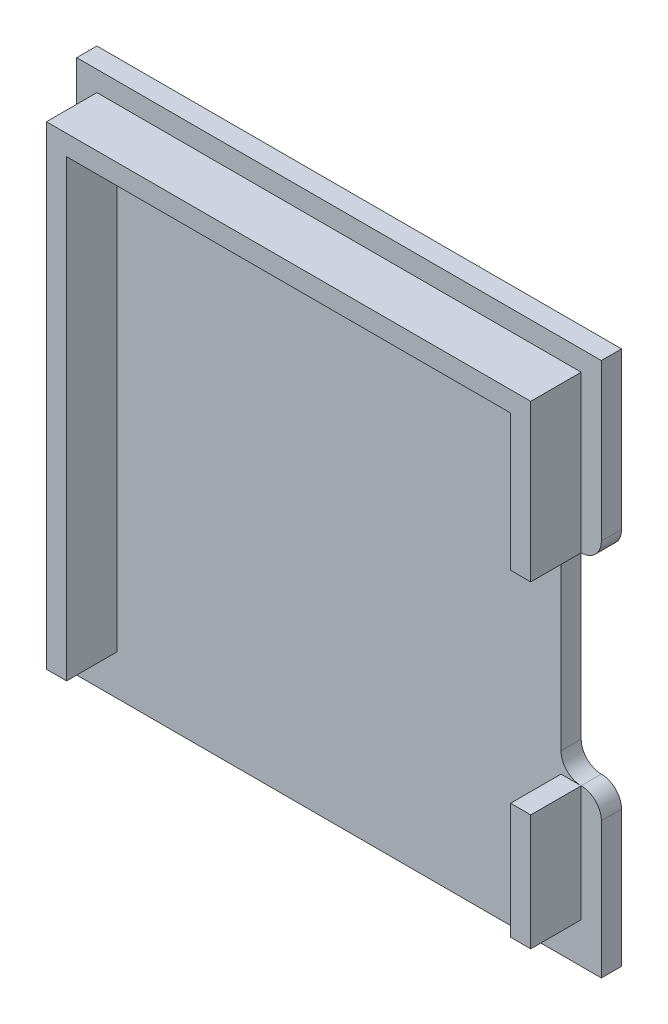
ISO-10303-21;
HEADER;
FILE_DESCRIPTION(('STEP AP214'),'2;1');
FILE_NAME('part.step','',(''),(''),'','','');
FILE_SCHEMA(('AUTOMOTIVE_DESIGN { 1 0 10303 214 1 1 1 1 }'));
ENDSEC;
DATA;
#1=APPLICATION_CONTEXT('core data for automotive mechanical design processes');
#2=APPLICATION_PROTOCOL_DEFINITION('international standard','automotive_design',2000,#1);
#3=PRODUCT_CONTEXT('',#1,'mechanical');
#4=PRODUCT('Part','Part','',(#3));
#5=PRODUCT_RELATED_PRODUCT_CATEGORY('part','',(#4));
#6=PRODUCT_DEFINITION_FORMATION('','',#4);
#7=PRODUCT_DEFINITION_CONTEXT('part definition',#1,'design');
#8=PRODUCT_DEFINITION('design','',#6,#7);
#9=PRODUCT_DEFINITION_SHAPE('','',#8);
#10=(LENGTH_UNIT() NAMED_UNIT(*) SI_UNIT(.MILLI.,.METRE.));
#11=(NAMED_UNIT(*) PLANE_ANGLE_UNIT() SI_UNIT($,.RADIAN.));
#12=(NAMED_UNIT(*) SI_UNIT($,.STERADIAN.) SOLID_ANGLE_UNIT());
#13=UNCERTAINTY_MEASURE_WITH_UNIT(LENGTH_MEASURE(1.E-05),#10,'distance_accuracy_value','');
#14=(GEOMETRIC_REPRESENTATION_CONTEXT(3) GLOBAL_UNCERTAINTY_ASSIGNED_CONTEXT((#13)) GLOBAL_UNIT_ASSIGNED_CONTEXT((#10,
#11,#12)) REPRESENTATION_CONTEXT('',''));
#15=CARTESIAN_POINT('',(0.,0.,0.));
#16=DIRECTION('',(0.,0.,1.));
#17=DIRECTION('',(1.,0.,0.));
#18=AXIS2_PLACEMENT_3D('',#15,#16,#17);
#19=CARTESIAN_POINT('',(0.,0.,7.));
#20=DIRECTION('',(0.,0.,-1.));
#21=DIRECTION('',(-1.,0.,0.));
#22=AXIS2_PLACEMENT_3D('',#19,#20,#21);
#23=PLANE('',#22);
#24=DIRECTION('',(0.,-1.,0.));
#25=VECTOR('',#24,1.);
#26=CARTESIAN_POINT('',(2.00000000000001,2.,7.));
#27=LINE('',#26,#25);
#28=CARTESIAN_POINT('',(2.00000000000001,51.,7.));
#29=VERTEX_POINT('',#28);
#30=CARTESIAN_POINT('',(2.00000000000001,4.,7.));
#31=VERTEX_POINT('',#30);
#32=EDGE_CURVE('E194',#29,#31,#27,.T.);
#33=ORIENTED_EDGE('',*,*,#32,.T.);
#34=DIRECTION('',(-1.,0.,0.));
#35=VECTOR('',#34,1.);
#36=CARTESIAN_POINT('',(2.00000000000001,4.,7.));
#37=LINE('',#36,#35);
#38=CARTESIAN_POINT('',(4.00000000000001,4.,7.));
#39=VERTEX_POINT('',#38);
#40=EDGE_CURVE('E177',#39,#31,#37,.T.);
#41=ORIENTED_EDGE('',*,*,#40,.F.);
#42=DIRECTION('',(0.,-1.,0.));
#43=VECTOR('',#42,1.);
#44=CARTESIAN_POINT('',(4.00000000000001,4.,7.));
#45=LINE('',#44,#43);
#46=CARTESIAN_POINT('',(4.00000000000001,49.,7.));
#47=VERTEX_POINT('',#46);
#48=EDGE_CURVE('E353',#47,#39,#45,.T.);
#49=ORIENTED_EDGE('',*,*,#48,.F.);
#50=DIRECTION('',(-1.,0.,0.));
#51=VECTOR('',#50,1.);
#52=CARTESIAN_POINT('',(4.00000000000001,49.,7.));
#53=LINE('',#52,#51);
#54=CARTESIAN_POINT('',(48.,49.,7.));
#55=VERTEX_POINT('',#54);
#56=EDGE_CURVE('E395',#55,#47,#53,.T.);
#57=ORIENTED_EDGE('',*,*,#56,.F.);
#58=DIRECTION('',(0.,1.,0.));
#59=VECTOR('',#58,1.);
#60=CARTESIAN_POINT('',(48.,4.,7.));
#61=LINE('',#60,#59);
#62=CARTESIAN_POINT('',(48.,35.5,7.));
#63=VERTEX_POINT('',#62);
#64=EDGE_CURVE('E360',#63,#55,#61,.T.);
#65=ORIENTED_EDGE('',*,*,#64,.F.);
#66=DIRECTION('',(-1.,0.,0.));
#67=VECTOR('',#66,1.);
#68=CARTESIAN_POINT('',(52.,35.5,7.));
#69=LINE('',#68,#67);
#70=CARTESIAN_POINT('',(50.,35.5,7.));
#71=VERTEX_POINT('',#70);
#72=EDGE_CURVE('E374',#71,#63,#69,.T.);
#73=ORIENTED_EDGE('',*,*,#72,.F.);
#74=DIRECTION('',(0.,1.,0.));
#75=VECTOR('',#74,1.);
#76=CARTESIAN_POINT('',(50.,2.,7.));
#77=LINE('',#76,#75);
#78=CARTESIAN_POINT('',(50.,51.,7.));
#79=VERTEX_POINT('',#78);
#80=EDGE_CURVE('E215',#71,#79,#77,.T.);
#81=ORIENTED_EDGE('',*,*,#80,.T.);
#82=DIRECTION('',(-1.,0.,0.));
#83=VECTOR('',#82,1.);
#84=CARTESIAN_POINT('',(2.00000000000001,51.,7.));
#85=LINE('',#84,#83);
#86=EDGE_CURVE('E199',#79,#29,#85,.T.);
#87=ORIENTED_EDGE('',*,*,#86,.T.);
#88=EDGE_LOOP('',(#33,#41,#49,#57,#65,#73,#81,#87));
#89=FACE_BOUND('',#88,.T.);
#90=ADVANCED_FACE('F33',(#89),#23,.F.);
#91=CARTESIAN_POINT('',(52.,0.,2.));
#92=DIRECTION('',(-1.,0.,0.));
#93=DIRECTION('',(0.,0.,1.));
#94=AXIS2_PLACEMENT_3D('',#91,#92,#93);
#95=PLANE('',#94);
#96=DIRECTION('',(0.,1.,0.));
#97=VECTOR('',#96,1.);
#98=CARTESIAN_POINT('',(52.,0.,2.));
#99=LINE('',#98,#97);
#100=CARTESIAN_POINT('',(52.,37.5,2.));
#101=VERTEX_POINT('',#100);
#102=CARTESIAN_POINT('',(52.,53.,2.));
#103=VERTEX_POINT('',#102);
#104=EDGE_CURVE('E226',#101,#103,#99,.T.);
#105=ORIENTED_EDGE('',*,*,#104,.F.);
#106=DIRECTION('',(0.,0.,-1.));
#107=VECTOR('',#106,1.);
#108=CARTESIAN_POINT('',(52.,37.5,2.));
#109=LINE('',#108,#107);
#110=CARTESIAN_POINT('',(52.,37.5,0.));
#111=VERTEX_POINT('',#110);
#112=EDGE_CURVE('E272',#101,#111,#109,.T.);
#113=ORIENTED_EDGE('',*,*,#112,.T.);
#114=DIRECTION('',(0.,1.,0.));
#115=VECTOR('',#114,1.);
#116=CARTESIAN_POINT('',(52.,0.,0.));
#117=LINE('',#116,#115);
#118=CARTESIAN_POINT('',(52.,53.,0.));
#119=VERTEX_POINT('',#118);
#120=EDGE_CURVE('E237',#111,#119,#117,.T.);
#121=ORIENTED_EDGE('',*,*,#120,.T.);
#122=DIRECTION('',(0.,0.,-1.));
#123=VECTOR('',#122,1.);
#124=CARTESIAN_POINT('',(52.,53.,2.));
#125=LINE('',#124,#123);
#126=EDGE_CURVE('E244',#103,#119,#125,.T.);
#127=ORIENTED_EDGE('',*,*,#126,.F.);
#128=EDGE_LOOP('',(#105,#113,#121,#127));
#129=FACE_BOUND('',#128,.T.);
#130=ADVANCED_FACE('F301',(#129),#95,.F.);
#131=CARTESIAN_POINT('',(50.,2.,7.));
#132=DIRECTION('',(-1.,0.,0.));
#133=DIRECTION('',(0.,0.,1.));
#134=AXIS2_PLACEMENT_3D('',#131,#132,#133);
#135=PLANE('',#134);
#136=ORIENTED_EDGE('',*,*,#80,.F.);
#137=DIRECTION('',(0.,0.,-1.));
#138=VECTOR('',#137,1.);
#139=CARTESIAN_POINT('',(50.,35.5,7.));
#140=LINE('',#139,#138);
#141=CARTESIAN_POINT('',(50.,35.5,2.));
#142=VERTEX_POINT('',#141);
#143=EDGE_CURVE('E334',#71,#142,#140,.T.);
#144=ORIENTED_EDGE('',*,*,#143,.T.);
#145=DIRECTION('',(0.,1.,0.));
#146=VECTOR('',#145,1.);
#147=CARTESIAN_POINT('',(50.,2.,2.));
#148=LINE('',#147,#146);
#149=CARTESIAN_POINT('',(50.,51.,2.));
#150=VERTEX_POINT('',#149);
#151=EDGE_CURVE('E212',#142,#150,#148,.T.);
#152=ORIENTED_EDGE('',*,*,#151,.T.);
#153=DIRECTION('',(0.,0.,-1.));
#154=VECTOR('',#153,1.);
#155=CARTESIAN_POINT('',(50.,51.,7.));
#156=LINE('',#155,#154);
#157=EDGE_CURVE('E203',#79,#150,#156,.T.);
#158=ORIENTED_EDGE('',*,*,#157,.F.);
#159=EDGE_LOOP('',(#136,#144,#152,#158));
#160=FACE_BOUND('',#159,.T.);
#161=ADVANCED_FACE('F380',(#160),#135,.F.);
#162=CARTESIAN_POINT('',(48.,4.,7.));
#163=DIRECTION('',(-1.,0.,0.));
#164=DIRECTION('',(0.,0.,1.));
#165=AXIS2_PLACEMENT_3D('',#162,#163,#164);
#166=PLANE('',#165);
#167=DIRECTION('',(0.,0.,-1.));
#168=VECTOR('',#167,1.);
#169=CARTESIAN_POINT('',(48.,35.5,27.3960780543711));
#170=LINE('',#169,#168);
#171=CARTESIAN_POINT('',(48.,35.5,2.));
#172=VERTEX_POINT('',#171);
#173=EDGE_CURVE('E387',#63,#172,#170,.T.);
#174=ORIENTED_EDGE('',*,*,#173,.F.);
#175=ORIENTED_EDGE('',*,*,#64,.T.);
#176=DIRECTION('',(0.,0.,-1.));
#177=VECTOR('',#176,1.);
#178=CARTESIAN_POINT('',(48.,49.,7.));
#179=LINE('',#178,#177);
#180=CARTESIAN_POINT('',(48.,49.,2.));
#181=VERTEX_POINT('',#180);
#182=EDGE_CURVE('E364',#55,#181,#179,.T.);
#183=ORIENTED_EDGE('',*,*,#182,.T.);
#184=DIRECTION('',(0.,1.,0.));
#185=VECTOR('',#184,1.);
#186=CARTESIAN_POINT('',(48.,4.,2.));
#187=LINE('',#186,#185);
#188=EDGE_CURVE('E348',#172,#181,#187,.T.);
#189=ORIENTED_EDGE('',*,*,#188,.F.);
#190=EDGE_LOOP('',(#174,#175,#183,#189));
#191=FACE_BOUND('',#190,.T.);
#192=ADVANCED_FACE('F404',(#191),#166,.T.);
#193=CARTESIAN_POINT('',(0.,0.,2.));
#194=DIRECTION('',(1.,0.,0.));
#195=DIRECTION('',(0.,0.,-1.));
#196=AXIS2_PLACEMENT_3D('',#193,#194,#195);
#197=PLANE('',#196);
#198=DIRECTION('',(0.,-1.,0.));
#199=VECTOR('',#198,1.);
#200=CARTESIAN_POINT('',(0.,0.,0.));
#201=LINE('',#200,#199);
#202=CARTESIAN_POINT('',(0.,53.,0.));
#203=VERTEX_POINT('',#202);
#204=CARTESIAN_POINT('',(0.,0.,0.));
#205=VERTEX_POINT('',#204);
#206=EDGE_CURVE('E219',#203,#205,#201,.T.);
#207=ORIENTED_EDGE('',*,*,#206,.T.);
#208=DIRECTION('',(0.,0.,-1.));
#209=VECTOR('',#208,1.);
#210=CARTESIAN_POINT('',(0.,0.,2.));
#211=LINE('',#210,#209);
#212=CARTESIAN_POINT('',(0.,0.,2.));
#213=VERTEX_POINT('',#212);
#214=EDGE_CURVE('E250',#213,#205,#211,.T.);
#215=ORIENTED_EDGE('',*,*,#214,.F.);
#216=DIRECTION('',(0.,-1.,0.));
#217=VECTOR('',#216,1.);
#218=CARTESIAN_POINT('',(0.,0.,2.));
#219=LINE('',#218,#217);
#220=CARTESIAN_POINT('',(0.,53.,2.));
#221=VERTEX_POINT('',#220);
#222=EDGE_CURVE('E220',#221,#213,#219,.T.);
#223=ORIENTED_EDGE('',*,*,#222,.F.);
#224=DIRECTION('',(0.,0.,-1.));
#225=VECTOR('',#224,1.);
#226=CARTESIAN_POINT('',(0.,53.,2.));
#227=LINE('',#226,#225);
#228=EDGE_CURVE('E232',#221,#203,#227,.T.);
#229=ORIENTED_EDGE('',*,*,#228,.T.);
#230=EDGE_LOOP('',(#207,#215,#223,#229));
#231=FACE_BOUND('',#230,.T.);
#232=ADVANCED_FACE('F312',(#231),#197,.F.);
#233=CARTESIAN_POINT('',(0.,0.,2.));
#234=DIRECTION('',(0.,1.,0.));
#235=DIRECTION('',(0.,0.,1.));
#236=AXIS2_PLACEMENT_3D('',#233,#234,#235);
#237=PLANE('',#236);
#238=DIRECTION('',(1.,0.,0.));
#239=VECTOR('',#238,1.);
#240=CARTESIAN_POINT('',(0.,0.,0.));
#241=LINE('',#240,#239);
#242=CARTESIAN_POINT('',(52.,0.,0.));
#243=VERTEX_POINT('',#242);
#244=EDGE_CURVE('E235',#205,#243,#241,.T.);
#245=ORIENTED_EDGE('',*,*,#244,.T.);
#246=DIRECTION('',(0.,0.,-1.));
#247=VECTOR('',#246,1.);
#248=CARTESIAN_POINT('',(52.,0.,2.));
#249=LINE('',#248,#247);
#250=CARTESIAN_POINT('',(52.,0.,2.));
#251=VERTEX_POINT('',#250);
#252=EDGE_CURVE('E247',#251,#243,#249,.T.);
#253=ORIENTED_EDGE('',*,*,#252,.F.);
#254=DIRECTION('',(1.,0.,0.));
#255=VECTOR('',#254,1.);
#256=CARTESIAN_POINT('',(0.,0.,2.));
#257=LINE('',#256,#255);
#258=EDGE_CURVE('E223',#213,#251,#257,.T.);
#259=ORIENTED_EDGE('',*,*,#258,.F.);
#260=ORIENTED_EDGE('',*,*,#214,.T.);
#261=EDGE_LOOP('',(#245,#253,#259,#260));
#262=FACE_BOUND('',#261,.T.);
#263=ADVANCED_FACE('F315',(#262),#237,.F.);
#264=CARTESIAN_POINT('',(52.,13.5,0.));
#265=VERTEX_POINT('',#264);
#266=EDGE_CURVE('E238',#243,#265,#117,.T.);
#267=ORIENTED_EDGE('',*,*,#266,.T.);
#268=DIRECTION('',(0.,0.,-1.));
#269=VECTOR('',#268,1.);
#270=CARTESIAN_POINT('',(52.,13.5,2.));
#271=LINE('',#270,#269);
#272=CARTESIAN_POINT('',(52.,13.5,2.));
#273=VERTEX_POINT('',#272);
#274=EDGE_CURVE('E257',#265,#273,#271,.F.);
#275=ORIENTED_EDGE('',*,*,#274,.T.);
#276=EDGE_CURVE('E227',#251,#273,#99,.T.);
#277=ORIENTED_EDGE('',*,*,#276,.F.);
#278=ORIENTED_EDGE('',*,*,#252,.T.);
#279=EDGE_LOOP('',(#267,#275,#277,#278));
#280=FACE_BOUND('',#279,.T.);
#281=ADVANCED_FACE('F319',(#280),#95,.F.);
#282=CARTESIAN_POINT('',(0.,53.,2.));
#283=DIRECTION('',(0.,-1.,0.));
#284=DIRECTION('',(0.,0.,-1.));
#285=AXIS2_PLACEMENT_3D('',#282,#283,#284);
#286=PLANE('',#285);
#287=DIRECTION('',(-1.,0.,0.));
#288=VECTOR('',#287,1.);
#289=CARTESIAN_POINT('',(0.,53.,0.));
#290=LINE('',#289,#288);
#291=EDGE_CURVE('E224',#119,#203,#290,.T.);
#292=ORIENTED_EDGE('',*,*,#291,.T.);
#293=ORIENTED_EDGE('',*,*,#228,.F.);
#294=DIRECTION('',(-1.,0.,0.));
#295=VECTOR('',#294,1.);
#296=CARTESIAN_POINT('',(0.,53.,2.));
#297=LINE('',#296,#295);
#298=EDGE_CURVE('E230',#103,#221,#297,.T.);
#299=ORIENTED_EDGE('',*,*,#298,.F.);
#300=ORIENTED_EDGE('',*,*,#126,.T.);
#301=EDGE_LOOP('',(#292,#293,#299,#300));
#302=FACE_BOUND('',#301,.T.);
#303=ADVANCED_FACE('F307',(#302),#286,.F.);
#304=CARTESIAN_POINT('',(0.,0.,0.));
#305=DIRECTION('',(0.,0.,-1.));
#306=DIRECTION('',(-1.,0.,0.));
#307=AXIS2_PLACEMENT_3D('',#304,#305,#306);
#308=PLANE('',#307);
#309=DIRECTION('',(0.,1.,0.));
#310=VECTOR('',#309,1.);
#311=CARTESIAN_POINT('',(48.,35.5,0.));
#312=LINE('',#311,#310);
#313=CARTESIAN_POINT('',(48.,17.5,0.));
#314=VERTEX_POINT('',#313);
#315=CARTESIAN_POINT('',(48.,33.5,0.));
#316=VERTEX_POINT('',#315);
#317=EDGE_CURVE('E280',#314,#316,#312,.T.);
#318=ORIENTED_EDGE('',*,*,#317,.F.);
#319=CARTESIAN_POINT('',(50.,17.5,0.));
#320=DIRECTION('',(0.,0.,-1.));
#321=DIRECTION('',(-1.,0.,0.));
#322=AXIS2_PLACEMENT_3D('',#319,#320,#321);
#323=CIRCLE('',#322,2.);
#324=CARTESIAN_POINT('',(50.,15.5,0.));
#325=VERTEX_POINT('',#324);
#326=EDGE_CURVE('E274',#314,#325,#323,.F.);
#327=ORIENTED_EDGE('',*,*,#326,.T.);
#328=CARTESIAN_POINT('',(50.,13.5,0.));
#329=DIRECTION('',(0.,0.,-1.));
#330=DIRECTION('',(-1.,0.,0.));
#331=AXIS2_PLACEMENT_3D('',#328,#329,#330);
#332=CIRCLE('',#331,2.);
#333=EDGE_CURVE('E255',#325,#265,#332,.T.);
#334=ORIENTED_EDGE('',*,*,#333,.T.);
#335=ORIENTED_EDGE('',*,*,#266,.F.);
#336=ORIENTED_EDGE('',*,*,#244,.F.);
#337=ORIENTED_EDGE('',*,*,#206,.F.);
#338=ORIENTED_EDGE('',*,*,#291,.F.);
#339=ORIENTED_EDGE('',*,*,#120,.F.);
#340=CARTESIAN_POINT('',(50.,37.5,0.));
#341=DIRECTION('',(0.,0.,-1.));
#342=DIRECTION('',(-1.,0.,0.));
#343=AXIS2_PLACEMENT_3D('',#340,#341,#342);
#344=CIRCLE('',#343,2.);
#345=CARTESIAN_POINT('',(50.,35.5,0.));
#346=VERTEX_POINT('',#345);
#347=EDGE_CURVE('E253',#111,#346,#344,.T.);
#348=ORIENTED_EDGE('',*,*,#347,.T.);
#349=CARTESIAN_POINT('',(50.,33.5,0.));
#350=DIRECTION('',(0.,0.,-1.));
#351=DIRECTION('',(-1.,0.,0.));
#352=AXIS2_PLACEMENT_3D('',#349,#350,#351);
#353=CIRCLE('',#352,2.);
#354=EDGE_CURVE('E42',#346,#316,#353,.F.);
#355=ORIENTED_EDGE('',*,*,#354,.T.);
#356=EDGE_LOOP('',(#318,#327,#334,#335,#336,#337,#338,#339,#348,#355));
#357=FACE_BOUND('',#356,.T.);
#358=ADVANCED_FACE('F428',(#357),#308,.T.);
#359=CARTESIAN_POINT('',(48.,4.,7.));
#360=VERTEX_POINT('',#359);
#361=CARTESIAN_POINT('',(48.,15.5,7.));
#362=VERTEX_POINT('',#361);
#363=EDGE_CURVE('E393',#360,#362,#61,.T.);
#364=ORIENTED_EDGE('',*,*,#363,.F.);
#365=CARTESIAN_POINT('',(50.,4.,7.));
#366=VERTEX_POINT('',#365);
#367=EDGE_CURVE('E188',#366,#360,#37,.T.);
#368=ORIENTED_EDGE('',*,*,#367,.F.);
#369=CARTESIAN_POINT('',(50.,15.5,7.));
#370=VERTEX_POINT('',#369);
#371=EDGE_CURVE('E205',#366,#370,#77,.T.);
#372=ORIENTED_EDGE('',*,*,#371,.T.);
#373=DIRECTION('',(1.,0.,0.));
#374=VECTOR('',#373,1.);
#375=CARTESIAN_POINT('',(48.,15.5,7.));
#376=LINE('',#375,#374);
#377=EDGE_CURVE('E331',#362,#370,#376,.T.);
#378=ORIENTED_EDGE('',*,*,#377,.F.);
#379=EDGE_LOOP('',(#364,#368,#372,#378));
#380=FACE_BOUND('',#379,.T.);
#381=ADVANCED_FACE('F420',(#380),#23,.F.);
#382=ORIENTED_EDGE('',*,*,#371,.F.);
#383=DIRECTION('',(0.,0.,1.));
#384=VECTOR('',#383,1.);
#385=CARTESIAN_POINT('',(50.,4.,-46.0416485978573));
#386=LINE('',#385,#384);
#387=CARTESIAN_POINT('',(50.,4.,2.));
#388=VERTEX_POINT('',#387);
#389=EDGE_CURVE('E383',#388,#366,#386,.T.);
#390=ORIENTED_EDGE('',*,*,#389,.F.);
#391=CARTESIAN_POINT('',(50.,15.5,2.));
#392=VERTEX_POINT('',#391);
#393=EDGE_CURVE('E209',#388,#392,#148,.T.);
#394=ORIENTED_EDGE('',*,*,#393,.T.);
#395=DIRECTION('',(0.,0.,1.));
#396=VECTOR('',#395,1.);
#397=CARTESIAN_POINT('',(50.,15.5,7.));
#398=LINE('',#397,#396);
#399=EDGE_CURVE('E325',#392,#370,#398,.T.);
#400=ORIENTED_EDGE('',*,*,#399,.T.);
#401=EDGE_LOOP('',(#382,#390,#394,#400));
#402=FACE_BOUND('',#401,.T.);
#403=ADVANCED_FACE('F427',(#402),#135,.F.);
#404=CARTESIAN_POINT('',(2.00000000000001,51.,7.));
#405=DIRECTION('',(0.,-1.,0.));
#406=DIRECTION('',(0.,0.,-1.));
#407=AXIS2_PLACEMENT_3D('',#404,#405,#406);
#408=PLANE('',#407);
#409=DIRECTION('',(-1.,0.,0.));
#410=VECTOR('',#409,1.);
#411=CARTESIAN_POINT('',(2.00000000000001,51.,2.));
#412=LINE('',#411,#410);
#413=CARTESIAN_POINT('',(2.00000000000001,51.,2.));
#414=VERTEX_POINT('',#413);
#415=EDGE_CURVE('E211',#150,#414,#412,.T.);
#416=ORIENTED_EDGE('',*,*,#415,.T.);
#417=DIRECTION('',(0.,0.,-1.));
#418=VECTOR('',#417,1.);
#419=CARTESIAN_POINT('',(2.00000000000001,51.,7.));
#420=LINE('',#419,#418);
#421=EDGE_CURVE('E201',#29,#414,#420,.T.);
#422=ORIENTED_EDGE('',*,*,#421,.F.);
#423=ORIENTED_EDGE('',*,*,#86,.F.);
#424=ORIENTED_EDGE('',*,*,#157,.T.);
#425=EDGE_LOOP('',(#416,#422,#423,#424));
#426=FACE_BOUND('',#425,.T.);
#427=ADVANCED_FACE('F379',(#426),#408,.F.);
#428=CARTESIAN_POINT('',(2.00000000000001,2.,7.));
#429=DIRECTION('',(1.,0.,0.));
#430=DIRECTION('',(0.,0.,-1.));
#431=AXIS2_PLACEMENT_3D('',#428,#429,#430);
#432=PLANE('',#431);
#433=DIRECTION('',(0.,-1.,0.));
#434=VECTOR('',#433,1.);
#435=CARTESIAN_POINT('',(2.00000000000001,2.,2.));
#436=LINE('',#435,#434);
#437=CARTESIAN_POINT('',(2.00000000000001,4.,2.));
#438=VERTEX_POINT('',#437);
#439=EDGE_CURVE('E195',#414,#438,#436,.T.);
#440=ORIENTED_EDGE('',*,*,#439,.T.);
#441=DIRECTION('',(0.,0.,1.));
#442=VECTOR('',#441,1.);
#443=CARTESIAN_POINT('',(2.00000000000001,4.,-46.0416485978573));
#444=LINE('',#443,#442);
#445=EDGE_CURVE('E180',#438,#31,#444,.T.);
#446=ORIENTED_EDGE('',*,*,#445,.T.);
#447=ORIENTED_EDGE('',*,*,#32,.F.);
#448=ORIENTED_EDGE('',*,*,#421,.T.);
#449=EDGE_LOOP('',(#440,#446,#447,#448));
#450=FACE_BOUND('',#449,.T.);
#451=ADVANCED_FACE('F192',(#450),#432,.F.);
#452=DIRECTION('',(0.,0.,-1.));
#453=VECTOR('',#452,1.);
#454=CARTESIAN_POINT('',(48.,15.5,27.3960780543711));
#455=LINE('',#454,#453);
#456=CARTESIAN_POINT('',(48.,15.5,2.));
#457=VERTEX_POINT('',#456);
#458=EDGE_CURVE('E285',#362,#457,#455,.T.);
#459=ORIENTED_EDGE('',*,*,#458,.T.);
#460=CARTESIAN_POINT('',(48.,4.,2.));
#461=VERTEX_POINT('',#460);
#462=EDGE_CURVE('E347',#461,#457,#187,.T.);
#463=ORIENTED_EDGE('',*,*,#462,.F.);
#464=DIRECTION('',(0.,0.,-1.));
#465=VECTOR('',#464,1.);
#466=CARTESIAN_POINT('',(48.,4.,7.));
#467=LINE('',#466,#465);
#468=EDGE_CURVE('E367',#360,#461,#467,.T.);
#469=ORIENTED_EDGE('',*,*,#468,.F.);
#470=ORIENTED_EDGE('',*,*,#363,.T.);
#471=EDGE_LOOP('',(#459,#463,#469,#470));
#472=FACE_BOUND('',#471,.T.);
#473=ADVANCED_FACE('F409',(#472),#166,.T.);
#474=CARTESIAN_POINT('',(4.00000000000001,49.,7.));
#475=DIRECTION('',(0.,-1.,0.));
#476=DIRECTION('',(0.,0.,-1.));
#477=AXIS2_PLACEMENT_3D('',#474,#475,#476);
#478=PLANE('',#477);
#479=DIRECTION('',(-1.,0.,0.));
#480=VECTOR('',#479,1.);
#481=CARTESIAN_POINT('',(4.00000000000001,49.,2.));
#482=LINE('',#481,#480);
#483=CARTESIAN_POINT('',(4.00000000000001,49.,2.));
#484=VERTEX_POINT('',#483);
#485=EDGE_CURVE('E350',#181,#484,#482,.T.);
#486=ORIENTED_EDGE('',*,*,#485,.F.);
#487=ORIENTED_EDGE('',*,*,#182,.F.);
#488=ORIENTED_EDGE('',*,*,#56,.T.);
#489=DIRECTION('',(0.,0.,-1.));
#490=VECTOR('',#489,1.);
#491=CARTESIAN_POINT('',(4.00000000000001,49.,7.));
#492=LINE('',#491,#490);
#493=EDGE_CURVE('E362',#47,#484,#492,.T.);
#494=ORIENTED_EDGE('',*,*,#493,.T.);
#495=EDGE_LOOP('',(#486,#487,#488,#494));
#496=FACE_BOUND('',#495,.T.);
#497=ADVANCED_FACE('F407',(#496),#478,.T.);
#498=CARTESIAN_POINT('',(4.00000000000001,4.,7.));
#499=DIRECTION('',(1.,0.,0.));
#500=DIRECTION('',(0.,0.,-1.));
#501=AXIS2_PLACEMENT_3D('',#498,#499,#500);
#502=PLANE('',#501);
#503=DIRECTION('',(0.,-1.,0.));
#504=VECTOR('',#503,1.);
#505=CARTESIAN_POINT('',(4.00000000000001,4.,2.));
#506=LINE('',#505,#504);
#507=CARTESIAN_POINT('',(4.00000000000001,4.,2.));
#508=VERTEX_POINT('',#507);
#509=EDGE_CURVE('E357',#484,#508,#506,.T.);
#510=ORIENTED_EDGE('',*,*,#509,.F.);
#511=ORIENTED_EDGE('',*,*,#493,.F.);
#512=ORIENTED_EDGE('',*,*,#48,.T.);
#513=DIRECTION('',(0.,0.,-1.));
#514=VECTOR('',#513,1.);
#515=CARTESIAN_POINT('',(4.00000000000001,4.,7.));
#516=LINE('',#515,#514);
#517=EDGE_CURVE('E183',#39,#508,#516,.T.);
#518=ORIENTED_EDGE('',*,*,#517,.T.);
#519=EDGE_LOOP('',(#510,#511,#512,#518));
#520=FACE_BOUND('',#519,.T.);
#521=ADVANCED_FACE('F401',(#520),#502,.T.);
#522=CARTESIAN_POINT('',(0.,0.,2.));
#523=DIRECTION('',(0.,0.,-1.));
#524=DIRECTION('',(-1.,0.,0.));
#525=AXIS2_PLACEMENT_3D('',#522,#523,#524);
#526=PLANE('',#525);
#527=ORIENTED_EDGE('',*,*,#393,.F.);
#528=DIRECTION('',(-1.,0.,0.));
#529=VECTOR('',#528,1.);
#530=CARTESIAN_POINT('',(2.00000000000001,4.,2.));
#531=LINE('',#530,#529);
#532=EDGE_CURVE('E196',#388,#461,#531,.T.);
#533=ORIENTED_EDGE('',*,*,#532,.T.);
#534=ORIENTED_EDGE('',*,*,#462,.T.);
#535=DIRECTION('',(-1.,0.,0.));
#536=VECTOR('',#535,1.);
#537=CARTESIAN_POINT('',(0.,15.5,2.));
#538=LINE('',#537,#536);
#539=EDGE_CURVE('E269',#392,#457,#538,.T.);
#540=ORIENTED_EDGE('',*,*,#539,.F.);
#541=CARTESIAN_POINT('',(50.,17.5,2.));
#542=DIRECTION('',(0.,0.,-1.));
#543=DIRECTION('',(-1.,0.,0.));
#544=AXIS2_PLACEMENT_3D('',#541,#542,#543);
#545=CIRCLE('',#544,2.);
#546=CARTESIAN_POINT('',(48.,17.5,2.));
#547=VERTEX_POINT('',#546);
#548=EDGE_CURVE('E276',#392,#547,#545,.T.);
#549=ORIENTED_EDGE('',*,*,#548,.T.);
#550=CARTESIAN_POINT('',(48.,33.5,2.));
#551=VERTEX_POINT('',#550);
#552=EDGE_CURVE('E342',#547,#551,#187,.T.);
#553=ORIENTED_EDGE('',*,*,#552,.T.);
#554=CARTESIAN_POINT('',(50.,33.5,2.));
#555=DIRECTION('',(0.,0.,-1.));
#556=DIRECTION('',(-1.,0.,0.));
#557=AXIS2_PLACEMENT_3D('',#554,#555,#556);
#558=CIRCLE('',#557,2.);
#559=EDGE_CURVE('E11',#551,#142,#558,.T.);
#560=ORIENTED_EDGE('',*,*,#559,.T.);
#561=DIRECTION('',(1.,0.,0.));
#562=VECTOR('',#561,1.);
#563=CARTESIAN_POINT('',(0.,35.5,2.));
#564=LINE('',#563,#562);
#565=EDGE_CURVE('E49',#172,#142,#564,.T.);
#566=ORIENTED_EDGE('',*,*,#565,.F.);
#567=ORIENTED_EDGE('',*,*,#188,.T.);
#568=ORIENTED_EDGE('',*,*,#485,.T.);
#569=ORIENTED_EDGE('',*,*,#509,.T.);
#570=EDGE_CURVE('E381',#508,#438,#531,.T.);
#571=ORIENTED_EDGE('',*,*,#570,.T.);
#572=ORIENTED_EDGE('',*,*,#439,.F.);
#573=ORIENTED_EDGE('',*,*,#415,.F.);
#574=ORIENTED_EDGE('',*,*,#151,.F.);
#575=CARTESIAN_POINT('',(50.,37.5,2.));
#576=DIRECTION('',(0.,0.,-1.));
#577=DIRECTION('',(-1.,0.,0.));
#578=AXIS2_PLACEMENT_3D('',#575,#576,#577);
#579=CIRCLE('',#578,2.);
#580=EDGE_CURVE('E260',#142,#101,#579,.F.);
#581=ORIENTED_EDGE('',*,*,#580,.T.);
#582=ORIENTED_EDGE('',*,*,#104,.T.);
#583=ORIENTED_EDGE('',*,*,#298,.T.);
#584=ORIENTED_EDGE('',*,*,#222,.T.);
#585=ORIENTED_EDGE('',*,*,#258,.T.);
#586=ORIENTED_EDGE('',*,*,#276,.T.);
#587=CARTESIAN_POINT('',(50.,13.5,2.));
#588=DIRECTION('',(0.,0.,-1.));
#589=DIRECTION('',(-1.,0.,0.));
#590=AXIS2_PLACEMENT_3D('',#587,#588,#589);
#591=CIRCLE('',#590,2.);
#592=EDGE_CURVE('E262',#273,#392,#591,.F.);
#593=ORIENTED_EDGE('',*,*,#592,.T.);
#594=EDGE_LOOP('',(#527,#533,#534,#540,#549,#553,#560,#566,#567,#568,#569,#571,#572,#573,#574,
#581,#582,#583,#584,#585,#586,#593));
#595=FACE_BOUND('',#594,.T.);
#596=ADVANCED_FACE('F297',(#595),#526,.F.);
#597=CARTESIAN_POINT('',(52.,35.5,27.3960780543711));
#598=DIRECTION('',(0.,1.,0.));
#599=DIRECTION('',(0.,0.,1.));
#600=AXIS2_PLACEMENT_3D('',#597,#598,#599);
#601=PLANE('',#600);
#602=ORIENTED_EDGE('',*,*,#173,.T.);
#603=ORIENTED_EDGE('',*,*,#565,.T.);
#604=ORIENTED_EDGE('',*,*,#143,.F.);
#605=ORIENTED_EDGE('',*,*,#72,.T.);
#606=EDGE_LOOP('',(#602,#603,#604,#605));
#607=FACE_BOUND('',#606,.T.);
#608=ADVANCED_FACE('F449',(#607),#601,.F.);
#609=CARTESIAN_POINT('',(48.,15.5,27.3960780543711));
#610=DIRECTION('',(0.,-1.,0.));
#611=DIRECTION('',(0.,0.,-1.));
#612=AXIS2_PLACEMENT_3D('',#609,#610,#611);
#613=PLANE('',#612);
#614=ORIENTED_EDGE('',*,*,#399,.F.);
#615=ORIENTED_EDGE('',*,*,#539,.T.);
#616=ORIENTED_EDGE('',*,*,#458,.F.);
#617=ORIENTED_EDGE('',*,*,#377,.T.);
#618=EDGE_LOOP('',(#614,#615,#616,#617));
#619=FACE_BOUND('',#618,.T.);
#620=ADVANCED_FACE('F327',(#619),#613,.F.);
#621=CARTESIAN_POINT('',(48.,35.5,27.3960780543711));
#622=DIRECTION('',(-1.,0.,0.));
#623=DIRECTION('',(0.,-1.,0.));
#624=AXIS2_PLACEMENT_3D('',#621,#622,#623);
#625=PLANE('',#624);
#626=ORIENTED_EDGE('',*,*,#552,.F.);
#627=DIRECTION('',(0.,0.,-1.));
#628=VECTOR('',#627,1.);
#629=CARTESIAN_POINT('',(48.,17.5,0.));
#630=LINE('',#629,#628);
#631=EDGE_CURVE('E267',#547,#314,#630,.T.);
#632=ORIENTED_EDGE('',*,*,#631,.T.);
#633=ORIENTED_EDGE('',*,*,#317,.T.);
#634=DIRECTION('',(0.,0.,-1.));
#635=VECTOR('',#634,1.);
#636=CARTESIAN_POINT('',(48.,33.5,2.));
#637=LINE('',#636,#635);
#638=EDGE_CURVE('E265',#316,#551,#637,.F.);
#639=ORIENTED_EDGE('',*,*,#638,.T.);
#640=EDGE_LOOP('',(#626,#632,#633,#639));
#641=FACE_BOUND('',#640,.T.);
#642=ADVANCED_FACE('F345',(#641),#625,.F.);
#643=CARTESIAN_POINT('',(50.,17.5,27.3960780543711));
#644=DIRECTION('',(0.,0.,1.));
#645=DIRECTION('',(1.,0.,0.));
#646=AXIS2_PLACEMENT_3D('',#643,#644,#645);
#647=CYLINDRICAL_SURFACE('',#646,2.);
#648=ORIENTED_EDGE('',*,*,#631,.F.);
#649=ORIENTED_EDGE('',*,*,#548,.F.);
#650=DIRECTION('',(0.,0.,-1.));
#651=VECTOR('',#650,1.);
#652=CARTESIAN_POINT('',(50.,15.5,2.));
#653=LINE('',#652,#651);
#654=EDGE_CURVE('E278',#325,#392,#653,.F.);
#655=ORIENTED_EDGE('',*,*,#654,.F.);
#656=ORIENTED_EDGE('',*,*,#326,.F.);
#657=EDGE_LOOP('',(#648,#649,#655,#656));
#658=FACE_BOUND('',#657,.T.);
#659=ADVANCED_FACE('F338',(#658),#647,.F.);
#660=CARTESIAN_POINT('',(50.,13.5,27.3960780543711));
#661=DIRECTION('',(0.,0.,-1.));
#662=DIRECTION('',(-1.,0.,0.));
#663=AXIS2_PLACEMENT_3D('',#660,#661,#662);
#664=CYLINDRICAL_SURFACE('',#663,2.);
#665=ORIENTED_EDGE('',*,*,#592,.F.);
#666=ORIENTED_EDGE('',*,*,#274,.F.);
#667=ORIENTED_EDGE('',*,*,#333,.F.);
#668=ORIENTED_EDGE('',*,*,#654,.T.);
#669=EDGE_LOOP('',(#665,#666,#667,#668));
#670=FACE_BOUND('',#669,.T.);
#671=ADVANCED_FACE('F471',(#670),#664,.T.);
#672=CARTESIAN_POINT('',(50.,37.5,2.));
#673=DIRECTION('',(0.,0.,-1.));
#674=DIRECTION('',(-1.,0.,0.));
#675=AXIS2_PLACEMENT_3D('',#672,#673,#674);
#676=CYLINDRICAL_SURFACE('',#675,2.);
#677=ORIENTED_EDGE('',*,*,#112,.F.);
#678=ORIENTED_EDGE('',*,*,#580,.F.);
#679=DIRECTION('',(0.,0.,-1.));
#680=VECTOR('',#679,1.);
#681=CARTESIAN_POINT('',(50.,35.5,27.3960780543711));
#682=LINE('',#681,#680);
#683=EDGE_CURVE('E37',#346,#142,#682,.F.);
#684=ORIENTED_EDGE('',*,*,#683,.F.);
#685=ORIENTED_EDGE('',*,*,#347,.F.);
#686=EDGE_LOOP('',(#677,#678,#684,#685));
#687=FACE_BOUND('',#686,.T.);
#688=ADVANCED_FACE('F35',(#687),#676,.T.);
#689=CARTESIAN_POINT('',(50.,33.5,27.3960780543711));
#690=DIRECTION('',(0.,0.,1.));
#691=DIRECTION('',(1.,0.,0.));
#692=AXIS2_PLACEMENT_3D('',#689,#690,#691);
#693=CYLINDRICAL_SURFACE('',#692,2.);
#694=ORIENTED_EDGE('',*,*,#559,.F.);
#695=ORIENTED_EDGE('',*,*,#638,.F.);
#696=ORIENTED_EDGE('',*,*,#354,.F.);
#697=ORIENTED_EDGE('',*,*,#683,.T.);
#698=EDGE_LOOP('',(#694,#695,#696,#697));
#699=FACE_BOUND('',#698,.T.);
#700=ADVANCED_FACE('F289',(#699),#693,.F.);
#701=CARTESIAN_POINT('',(2.00000000000001,4.,-46.0416485978573));
#702=DIRECTION('',(0.,1.,0.));
#703=DIRECTION('',(-1.,0.,0.));
#704=AXIS2_PLACEMENT_3D('',#701,#702,#703);
#705=PLANE('',#704);
#706=ORIENTED_EDGE('',*,*,#468,.T.);
#707=ORIENTED_EDGE('',*,*,#532,.F.);
#708=ORIENTED_EDGE('',*,*,#389,.T.);
#709=ORIENTED_EDGE('',*,*,#367,.T.);
#710=EDGE_LOOP('',(#706,#707,#708,#709));
#711=FACE_BOUND('',#710,.T.);
#712=ADVANCED_FACE('F440',(#711),#705,.F.);
#713=ORIENTED_EDGE('',*,*,#517,.F.);
#714=ORIENTED_EDGE('',*,*,#40,.T.);
#715=ORIENTED_EDGE('',*,*,#445,.F.);
#716=ORIENTED_EDGE('',*,*,#570,.F.);
#717=EDGE_LOOP('',(#713,#714,#715,#716));
#718=FACE_BOUND('',#717,.T.);
#719=ADVANCED_FACE('F179',(#718),#705,.F.);
#720=CLOSED_SHELL('',(#90,#130,#161,#192,#232,#263,#281,#303,#358,#381,#403,#427,#451,#473,#497,
#521,#596,#608,#620,#642,#659,#671,#688,#700,#712,#719));
#721=MANIFOLD_SOLID_BREP('B2',#720);
#722=ADVANCED_BREP_SHAPE_REPRESENTATION('',(#18,#721),#14);
#723=SHAPE_DEFINITION_REPRESENTATION(#9,#722);
ENDSEC;
END-ISO-10303-21;
